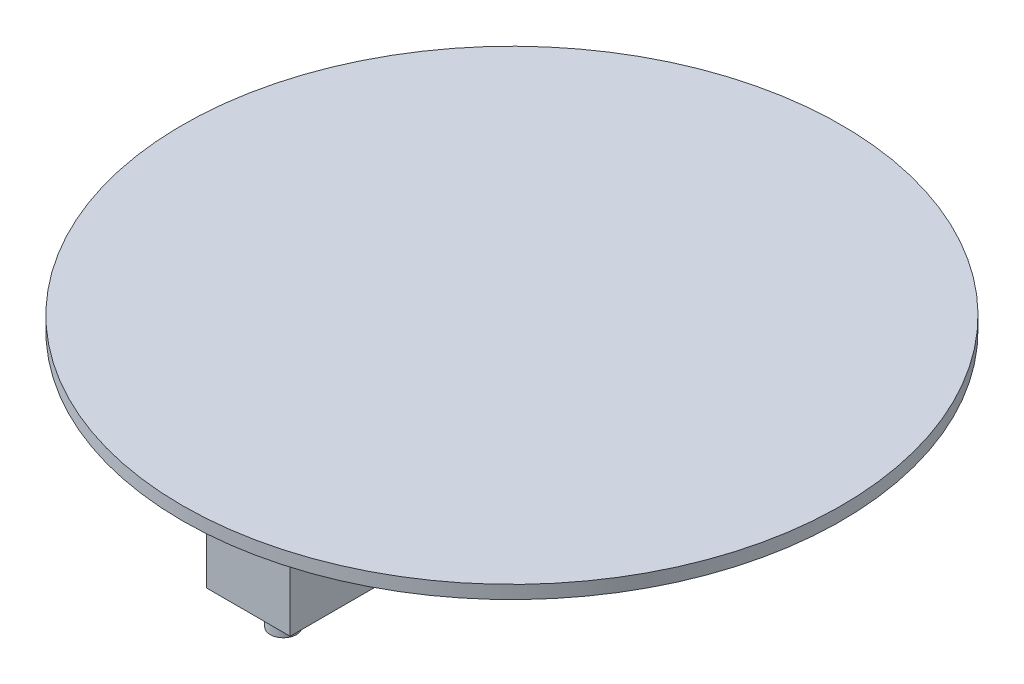
ISO-10303-21;
HEADER;
FILE_DESCRIPTION(('STEP AP214'),'2;1');
FILE_NAME('part.step','',(''),(''),'','','');
FILE_SCHEMA(('AUTOMOTIVE_DESIGN { 1 0 10303 214 1 1 1 1 }'));
ENDSEC;
DATA;
#1=APPLICATION_CONTEXT('core data for automotive mechanical design processes');
#2=APPLICATION_PROTOCOL_DEFINITION('international standard','automotive_design',2000,#1);
#3=PRODUCT_CONTEXT('',#1,'mechanical');
#4=PRODUCT('Part','Part','',(#3));
#5=PRODUCT_RELATED_PRODUCT_CATEGORY('part','',(#4));
#6=PRODUCT_DEFINITION_FORMATION('','',#4);
#7=PRODUCT_DEFINITION_CONTEXT('part definition',#1,'design');
#8=PRODUCT_DEFINITION('design','',#6,#7);
#9=PRODUCT_DEFINITION_SHAPE('','',#8);
#10=(LENGTH_UNIT() NAMED_UNIT(*) SI_UNIT(.MILLI.,.METRE.));
#11=(NAMED_UNIT(*) PLANE_ANGLE_UNIT() SI_UNIT($,.RADIAN.));
#12=(NAMED_UNIT(*) SI_UNIT($,.STERADIAN.) SOLID_ANGLE_UNIT());
#13=UNCERTAINTY_MEASURE_WITH_UNIT(LENGTH_MEASURE(1.E-05),#10,'distance_accuracy_value','');
#14=(GEOMETRIC_REPRESENTATION_CONTEXT(3) GLOBAL_UNCERTAINTY_ASSIGNED_CONTEXT((#13)) GLOBAL_UNIT_ASSIGNED_CONTEXT((#10,
#11,#12)) REPRESENTATION_CONTEXT('',''));
#15=CARTESIAN_POINT('',(0.,0.,0.));
#16=DIRECTION('',(0.,0.,1.));
#17=DIRECTION('',(1.,0.,0.));
#18=AXIS2_PLACEMENT_3D('',#15,#16,#17);
#19=CARTESIAN_POINT('',(0.,0.,80.));
#20=DIRECTION('',(1.,0.,0.));
#21=DIRECTION('',(0.,0.,-1.));
#22=AXIS2_PLACEMENT_3D('',#19,#20,#21);
#23=PLANE('',#22);
#24=CARTESIAN_POINT('',(0.,6.35,43.8));
#25=DIRECTION('',(-1.,0.,0.));
#26=DIRECTION('',(0.,0.,1.));
#27=AXIS2_PLACEMENT_3D('',#24,#25,#26);
#28=CIRCLE('',#27,5.25);
#29=CARTESIAN_POINT('',(0.,2.72750086266401,40.));
#30=VERTEX_POINT('',#29);
#31=CARTESIAN_POINT('',(0.,9.97249913733599,40.));
#32=VERTEX_POINT('',#31);
#33=EDGE_CURVE('E96',#30,#32,#28,.T.);
#34=ORIENTED_EDGE('',*,*,#33,.F.);
#35=CARTESIAN_POINT('',(0.,6.35,36.2));
#36=DIRECTION('',(-1.,0.,0.));
#37=DIRECTION('',(0.,0.,1.));
#38=AXIS2_PLACEMENT_3D('',#35,#36,#37);
#39=CIRCLE('',#38,5.25);
#40=EDGE_CURVE('E47',#32,#30,#39,.T.);
#41=ORIENTED_EDGE('',*,*,#40,.F.);
#42=EDGE_LOOP('',(#34,#41));
#43=FACE_BOUND('',#42,.T.);
#44=DIRECTION('',(0.,-1.,0.));
#45=VECTOR('',#44,1.);
#46=CARTESIAN_POINT('',(0.,0.,0.));
#47=LINE('',#46,#45);
#48=CARTESIAN_POINT('',(0.,12.7,0.));
#49=VERTEX_POINT('',#48);
#50=CARTESIAN_POINT('',(0.,0.,0.));
#51=VERTEX_POINT('',#50);
#52=EDGE_CURVE('E109',#49,#51,#47,.T.);
#53=ORIENTED_EDGE('',*,*,#52,.T.);
#54=DIRECTION('',(0.,0.,-1.));
#55=VECTOR('',#54,1.);
#56=CARTESIAN_POINT('',(0.,0.,80.));
#57=LINE('',#56,#55);
#58=CARTESIAN_POINT('',(0.,0.,80.));
#59=VERTEX_POINT('',#58);
#60=EDGE_CURVE('E11',#59,#51,#57,.T.);
#61=ORIENTED_EDGE('',*,*,#60,.F.);
#62=DIRECTION('',(0.,-1.,0.));
#63=VECTOR('',#62,1.);
#64=CARTESIAN_POINT('',(0.,0.,80.));
#65=LINE('',#64,#63);
#66=CARTESIAN_POINT('',(0.,12.7,80.));
#67=VERTEX_POINT('',#66);
#68=EDGE_CURVE('E112',#67,#59,#65,.T.);
#69=ORIENTED_EDGE('',*,*,#68,.F.);
#70=DIRECTION('',(0.,0.,-1.));
#71=VECTOR('',#70,1.);
#72=CARTESIAN_POINT('',(0.,12.7,80.));
#73=LINE('',#72,#71);
#74=EDGE_CURVE('E122',#67,#49,#73,.T.);
#75=ORIENTED_EDGE('',*,*,#74,.T.);
#76=EDGE_LOOP('',(#53,#61,#69,#75));
#77=FACE_BOUND('',#76,.T.);
#78=ADVANCED_FACE('F33',(#43,#77),#23,.F.);
#79=CARTESIAN_POINT('',(0.,0.,80.));
#80=DIRECTION('',(0.,1.,0.));
#81=DIRECTION('',(0.,0.,1.));
#82=AXIS2_PLACEMENT_3D('',#79,#80,#81);
#83=PLANE('',#82);
#84=CARTESIAN_POINT('',(6.6687205362473,0.,60.));
#85=DIRECTION('',(0.,1.,0.));
#86=DIRECTION('',(0.,0.,1.));
#87=AXIS2_PLACEMENT_3D('',#84,#85,#86);
#88=CIRCLE('',#87,2.);
#89=CARTESIAN_POINT('',(6.6687205362473,0.,62.));
#90=VERTEX_POINT('',#89);
#91=EDGE_CURVE('E220',#90,#90,#88,.T.);
#92=ORIENTED_EDGE('',*,*,#91,.T.);
#93=EDGE_LOOP('',(#92));
#94=FACE_BOUND('',#93,.T.);
#95=CARTESIAN_POINT('',(6.6687205362473,0.,75.));
#96=DIRECTION('',(0.,1.,0.));
#97=DIRECTION('',(0.,0.,1.));
#98=AXIS2_PLACEMENT_3D('',#95,#96,#97);
#99=CIRCLE('',#98,2.);
#100=CARTESIAN_POINT('',(6.6687205362473,0.,77.));
#101=VERTEX_POINT('',#100);
#102=EDGE_CURVE('E229',#101,#101,#99,.T.);
#103=ORIENTED_EDGE('',*,*,#102,.T.);
#104=EDGE_LOOP('',(#103));
#105=FACE_BOUND('',#104,.T.);
#106=DIRECTION('',(1.,0.,0.));
#107=VECTOR('',#106,1.);
#108=CARTESIAN_POINT('',(0.,0.,0.));
#109=LINE('',#108,#107);
#110=CARTESIAN_POINT('',(12.7,0.,0.));
#111=VERTEX_POINT('',#110);
#112=EDGE_CURVE('E125',#51,#111,#109,.T.);
#113=ORIENTED_EDGE('',*,*,#112,.T.);
#114=DIRECTION('',(0.,0.,-1.));
#115=VECTOR('',#114,1.);
#116=CARTESIAN_POINT('',(12.7,0.,80.));
#117=LINE('',#116,#115);
#118=CARTESIAN_POINT('',(12.7,0.,80.));
#119=VERTEX_POINT('',#118);
#120=EDGE_CURVE('E40',#119,#111,#117,.T.);
#121=ORIENTED_EDGE('',*,*,#120,.F.);
#122=DIRECTION('',(1.,0.,0.));
#123=VECTOR('',#122,1.);
#124=CARTESIAN_POINT('',(0.,0.,80.));
#125=LINE('',#124,#123);
#126=EDGE_CURVE('E115',#59,#119,#125,.T.);
#127=ORIENTED_EDGE('',*,*,#126,.F.);
#128=ORIENTED_EDGE('',*,*,#60,.T.);
#129=EDGE_LOOP('',(#113,#121,#127,#128));
#130=FACE_BOUND('',#129,.T.);
#131=ADVANCED_FACE('F153',(#94,#105,#130),#83,.F.);
#132=CARTESIAN_POINT('',(12.7,0.,80.));
#133=DIRECTION('',(-1.,0.,0.));
#134=DIRECTION('',(0.,0.,1.));
#135=AXIS2_PLACEMENT_3D('',#132,#133,#134);
#136=PLANE('',#135);
#137=CARTESIAN_POINT('',(12.7,6.35,43.8));
#138=DIRECTION('',(-1.,0.,0.));
#139=DIRECTION('',(0.,0.,1.));
#140=AXIS2_PLACEMENT_3D('',#137,#138,#139);
#141=CIRCLE('',#140,5.25);
#142=CARTESIAN_POINT('',(12.7,2.72750086266401,40.));
#143=VERTEX_POINT('',#142);
#144=CARTESIAN_POINT('',(12.7,9.97249913733599,40.));
#145=VERTEX_POINT('',#144);
#146=EDGE_CURVE('E88',#143,#145,#141,.T.);
#147=ORIENTED_EDGE('',*,*,#146,.T.);
#148=CARTESIAN_POINT('',(12.7,6.35,36.2));
#149=DIRECTION('',(-1.,0.,0.));
#150=DIRECTION('',(0.,0.,1.));
#151=AXIS2_PLACEMENT_3D('',#148,#149,#150);
#152=CIRCLE('',#151,5.25);
#153=EDGE_CURVE('E52',#145,#143,#152,.T.);
#154=ORIENTED_EDGE('',*,*,#153,.T.);
#155=EDGE_LOOP('',(#147,#154));
#156=FACE_BOUND('',#155,.T.);
#157=DIRECTION('',(0.,1.,0.));
#158=VECTOR('',#157,1.);
#159=CARTESIAN_POINT('',(12.7,0.,0.));
#160=LINE('',#159,#158);
#161=CARTESIAN_POINT('',(12.7,12.7,0.));
#162=VERTEX_POINT('',#161);
#163=EDGE_CURVE('E127',#111,#162,#160,.T.);
#164=ORIENTED_EDGE('',*,*,#163,.T.);
#165=DIRECTION('',(0.,0.,-1.));
#166=VECTOR('',#165,1.);
#167=CARTESIAN_POINT('',(12.7,12.7,80.));
#168=LINE('',#167,#166);
#169=CARTESIAN_POINT('',(12.7,12.7,80.));
#170=VERTEX_POINT('',#169);
#171=EDGE_CURVE('E132',#170,#162,#168,.T.);
#172=ORIENTED_EDGE('',*,*,#171,.F.);
#173=DIRECTION('',(0.,1.,0.));
#174=VECTOR('',#173,1.);
#175=CARTESIAN_POINT('',(12.7,0.,80.));
#176=LINE('',#175,#174);
#177=EDGE_CURVE('E118',#119,#170,#176,.T.);
#178=ORIENTED_EDGE('',*,*,#177,.F.);
#179=ORIENTED_EDGE('',*,*,#120,.T.);
#180=EDGE_LOOP('',(#164,#172,#178,#179));
#181=FACE_BOUND('',#180,.T.);
#182=ADVANCED_FACE('F94',(#156,#181),#136,.F.);
#183=CARTESIAN_POINT('',(0.,12.7,80.));
#184=DIRECTION('',(0.,-1.,0.));
#185=DIRECTION('',(0.,0.,-1.));
#186=AXIS2_PLACEMENT_3D('',#183,#184,#185);
#187=PLANE('',#186);
#188=CARTESIAN_POINT('',(6.6687205362473,12.7,5.));
#189=DIRECTION('',(0.,1.,0.));
#190=DIRECTION('',(0.,0.,1.));
#191=AXIS2_PLACEMENT_3D('',#188,#189,#190);
#192=CIRCLE('',#191,2.);
#193=CARTESIAN_POINT('',(6.6687205362473,12.7,7.));
#194=VERTEX_POINT('',#193);
#195=EDGE_CURVE('E106',#194,#194,#192,.T.);
#196=ORIENTED_EDGE('',*,*,#195,.F.);
#197=EDGE_LOOP('',(#196));
#198=FACE_BOUND('',#197,.T.);
#199=CARTESIAN_POINT('',(6.6687205362473,12.7,20.));
#200=DIRECTION('',(0.,1.,0.));
#201=DIRECTION('',(0.,0.,1.));
#202=AXIS2_PLACEMENT_3D('',#199,#200,#201);
#203=CIRCLE('',#202,2.);
#204=CARTESIAN_POINT('',(6.6687205362473,12.7,22.));
#205=VERTEX_POINT('',#204);
#206=EDGE_CURVE('E104',#205,#205,#203,.T.);
#207=ORIENTED_EDGE('',*,*,#206,.F.);
#208=EDGE_LOOP('',(#207));
#209=FACE_BOUND('',#208,.T.);
#210=DIRECTION('',(-1.,0.,0.));
#211=VECTOR('',#210,1.);
#212=CARTESIAN_POINT('',(0.,12.7,0.));
#213=LINE('',#212,#211);
#214=EDGE_CURVE('E116',#162,#49,#213,.T.);
#215=ORIENTED_EDGE('',*,*,#214,.T.);
#216=ORIENTED_EDGE('',*,*,#74,.F.);
#217=DIRECTION('',(-1.,0.,0.));
#218=VECTOR('',#217,1.);
#219=CARTESIAN_POINT('',(0.,12.7,80.));
#220=LINE('',#219,#218);
#221=EDGE_CURVE('E120',#170,#67,#220,.T.);
#222=ORIENTED_EDGE('',*,*,#221,.F.);
#223=ORIENTED_EDGE('',*,*,#171,.T.);
#224=EDGE_LOOP('',(#215,#216,#222,#223));
#225=FACE_BOUND('',#224,.T.);
#226=ADVANCED_FACE('F146',(#198,#209,#225),#187,.F.);
#227=CARTESIAN_POINT('',(0.,0.,80.));
#228=DIRECTION('',(0.,0.,-1.));
#229=DIRECTION('',(-1.,0.,0.));
#230=AXIS2_PLACEMENT_3D('',#227,#228,#229);
#231=PLANE('',#230);
#232=ORIENTED_EDGE('',*,*,#68,.T.);
#233=ORIENTED_EDGE('',*,*,#126,.T.);
#234=ORIENTED_EDGE('',*,*,#177,.T.);
#235=ORIENTED_EDGE('',*,*,#221,.T.);
#236=EDGE_LOOP('',(#232,#233,#234,#235));
#237=FACE_BOUND('',#236,.T.);
#238=ADVANCED_FACE('F152',(#237),#231,.F.);
#239=CARTESIAN_POINT('',(0.,0.,0.));
#240=DIRECTION('',(0.,0.,-1.));
#241=DIRECTION('',(-1.,0.,0.));
#242=AXIS2_PLACEMENT_3D('',#239,#240,#241);
#243=PLANE('',#242);
#244=ORIENTED_EDGE('',*,*,#52,.F.);
#245=ORIENTED_EDGE('',*,*,#214,.F.);
#246=ORIENTED_EDGE('',*,*,#163,.F.);
#247=ORIENTED_EDGE('',*,*,#112,.F.);
#248=EDGE_LOOP('',(#244,#245,#246,#247));
#249=FACE_BOUND('',#248,.T.);
#250=ADVANCED_FACE('F143',(#249),#243,.T.);
#251=CARTESIAN_POINT('',(12.7,6.35,36.2));
#252=DIRECTION('',(-1.,0.,0.));
#253=DIRECTION('',(0.,0.,1.));
#254=AXIS2_PLACEMENT_3D('',#251,#252,#253);
#255=CYLINDRICAL_SURFACE('',#254,5.25);
#256=ORIENTED_EDGE('',*,*,#40,.T.);
#257=DIRECTION('',(-1.,0.,0.));
#258=VECTOR('',#257,1.);
#259=CARTESIAN_POINT('',(12.7,2.72750086266401,40.));
#260=LINE('',#259,#258);
#261=EDGE_CURVE('E81',#143,#30,#260,.T.);
#262=ORIENTED_EDGE('',*,*,#261,.F.);
#263=ORIENTED_EDGE('',*,*,#153,.F.);
#264=DIRECTION('',(-1.,0.,0.));
#265=VECTOR('',#264,1.);
#266=CARTESIAN_POINT('',(12.7,9.97249913733599,40.));
#267=LINE('',#266,#265);
#268=EDGE_CURVE('E87',#145,#32,#267,.T.);
#269=ORIENTED_EDGE('',*,*,#268,.T.);
#270=EDGE_LOOP('',(#256,#262,#263,#269));
#271=FACE_BOUND('',#270,.T.);
#272=ADVANCED_FACE('F83',(#271),#255,.F.);
#273=CARTESIAN_POINT('',(12.7,6.35,43.8));
#274=DIRECTION('',(-1.,0.,0.));
#275=DIRECTION('',(0.,0.,1.));
#276=AXIS2_PLACEMENT_3D('',#273,#274,#275);
#277=CYLINDRICAL_SURFACE('',#276,5.25);
#278=ORIENTED_EDGE('',*,*,#33,.T.);
#279=ORIENTED_EDGE('',*,*,#268,.F.);
#280=ORIENTED_EDGE('',*,*,#146,.F.);
#281=ORIENTED_EDGE('',*,*,#261,.T.);
#282=EDGE_LOOP('',(#278,#279,#280,#281));
#283=FACE_BOUND('',#282,.T.);
#284=ADVANCED_FACE('F91',(#283),#277,.F.);
#285=CARTESIAN_POINT('',(6.6687205362473,17.,20.));
#286=DIRECTION('',(0.,-1.,0.));
#287=DIRECTION('',(0.,0.,-1.));
#288=AXIS2_PLACEMENT_3D('',#285,#286,#287);
#289=CYLINDRICAL_SURFACE('',#288,2.);
#290=CARTESIAN_POINT('',(6.6687205362473,17.,20.));
#291=DIRECTION('',(0.,1.,0.));
#292=DIRECTION('',(0.,0.,1.));
#293=AXIS2_PLACEMENT_3D('',#290,#291,#292);
#294=CIRCLE('',#293,2.);
#295=CARTESIAN_POINT('',(6.6687205362473,17.,22.));
#296=VERTEX_POINT('',#295);
#297=EDGE_CURVE('E100',#296,#296,#294,.T.);
#298=ORIENTED_EDGE('',*,*,#297,.F.);
#299=EDGE_LOOP('',(#298));
#300=FACE_BOUND('',#299,.T.);
#301=ORIENTED_EDGE('',*,*,#206,.T.);
#302=EDGE_LOOP('',(#301));
#303=FACE_BOUND('',#302,.T.);
#304=ADVANCED_FACE('F176',(#300,#303),#289,.T.);
#305=CARTESIAN_POINT('',(6.6687205362473,17.,5.));
#306=DIRECTION('',(0.,-1.,0.));
#307=DIRECTION('',(0.,0.,-1.));
#308=AXIS2_PLACEMENT_3D('',#305,#306,#307);
#309=CYLINDRICAL_SURFACE('',#308,2.);
#310=CARTESIAN_POINT('',(6.6687205362473,17.,5.));
#311=DIRECTION('',(0.,1.,0.));
#312=DIRECTION('',(0.,0.,1.));
#313=AXIS2_PLACEMENT_3D('',#310,#311,#312);
#314=CIRCLE('',#313,2.);
#315=CARTESIAN_POINT('',(6.6687205362473,17.,7.));
#316=VERTEX_POINT('',#315);
#317=EDGE_CURVE('E231',#316,#316,#314,.T.);
#318=ORIENTED_EDGE('',*,*,#317,.F.);
#319=EDGE_LOOP('',(#318));
#320=FACE_BOUND('',#319,.T.);
#321=ORIENTED_EDGE('',*,*,#195,.T.);
#322=EDGE_LOOP('',(#321));
#323=FACE_BOUND('',#322,.T.);
#324=ADVANCED_FACE('F179',(#320,#323),#309,.T.);
#325=CARTESIAN_POINT('',(6.6687205362473,-4.3,75.));
#326=DIRECTION('',(0.,1.,0.));
#327=DIRECTION('',(0.,0.,1.));
#328=AXIS2_PLACEMENT_3D('',#325,#326,#327);
#329=CYLINDRICAL_SURFACE('',#328,2.);
#330=CARTESIAN_POINT('',(6.6687205362473,-4.3,75.));
#331=DIRECTION('',(0.,1.,0.));
#332=DIRECTION('',(0.,0.,1.));
#333=AXIS2_PLACEMENT_3D('',#330,#331,#332);
#334=CIRCLE('',#333,2.);
#335=CARTESIAN_POINT('',(6.6687205362473,-4.3,77.));
#336=VERTEX_POINT('',#335);
#337=EDGE_CURVE('E226',#336,#336,#334,.T.);
#338=ORIENTED_EDGE('',*,*,#337,.T.);
#339=EDGE_LOOP('',(#338));
#340=FACE_BOUND('',#339,.T.);
#341=ORIENTED_EDGE('',*,*,#102,.F.);
#342=EDGE_LOOP('',(#341));
#343=FACE_BOUND('',#342,.T.);
#344=ADVANCED_FACE('F183',(#340,#343),#329,.T.);
#345=CARTESIAN_POINT('',(6.6687205362473,-4.3,75.));
#346=DIRECTION('',(0.,1.,0.));
#347=DIRECTION('',(0.,0.,1.));
#348=AXIS2_PLACEMENT_3D('',#345,#346,#347);
#349=PLANE('',#348);
#350=ORIENTED_EDGE('',*,*,#337,.F.);
#351=EDGE_LOOP('',(#350));
#352=FACE_BOUND('',#351,.T.);
#353=ADVANCED_FACE('F187',(#352),#349,.F.);
#354=CARTESIAN_POINT('',(6.6687205362473,-4.3,60.));
#355=DIRECTION('',(0.,1.,0.));
#356=DIRECTION('',(0.,0.,1.));
#357=AXIS2_PLACEMENT_3D('',#354,#355,#356);
#358=CYLINDRICAL_SURFACE('',#357,2.);
#359=CARTESIAN_POINT('',(6.6687205362473,-4.3,60.));
#360=DIRECTION('',(0.,1.,0.));
#361=DIRECTION('',(0.,0.,1.));
#362=AXIS2_PLACEMENT_3D('',#359,#360,#361);
#363=CIRCLE('',#362,2.);
#364=CARTESIAN_POINT('',(6.6687205362473,-4.3,62.));
#365=VERTEX_POINT('',#364);
#366=EDGE_CURVE('E216',#365,#365,#363,.T.);
#367=ORIENTED_EDGE('',*,*,#366,.T.);
#368=EDGE_LOOP('',(#367));
#369=FACE_BOUND('',#368,.T.);
#370=ORIENTED_EDGE('',*,*,#91,.F.);
#371=EDGE_LOOP('',(#370));
#372=FACE_BOUND('',#371,.T.);
#373=ADVANCED_FACE('F191',(#369,#372),#358,.T.);
#374=CARTESIAN_POINT('',(6.6687205362473,-4.3,60.));
#375=DIRECTION('',(0.,1.,0.));
#376=DIRECTION('',(0.,0.,1.));
#377=AXIS2_PLACEMENT_3D('',#374,#375,#376);
#378=PLANE('',#377);
#379=ORIENTED_EDGE('',*,*,#366,.F.);
#380=EDGE_LOOP('',(#379));
#381=FACE_BOUND('',#380,.T.);
#382=ADVANCED_FACE('F195',(#381),#378,.F.);
#383=CARTESIAN_POINT('',(6.35,19.,40.));
#384=DIRECTION('',(0.,-1.,0.));
#385=DIRECTION('',(0.,0.,-1.));
#386=AXIS2_PLACEMENT_3D('',#383,#384,#385);
#387=CYLINDRICAL_SURFACE('',#386,50.);
#388=CARTESIAN_POINT('',(6.35,19.,40.));
#389=DIRECTION('',(0.,1.,0.));
#390=DIRECTION('',(0.,0.,1.));
#391=AXIS2_PLACEMENT_3D('',#388,#389,#390);
#392=CIRCLE('',#391,50.);
#393=CARTESIAN_POINT('',(6.35,19.,90.));
#394=VERTEX_POINT('',#393);
#395=EDGE_CURVE('E215',#394,#394,#392,.T.);
#396=ORIENTED_EDGE('',*,*,#395,.F.);
#397=EDGE_LOOP('',(#396));
#398=FACE_BOUND('',#397,.T.);
#399=CARTESIAN_POINT('',(6.35,17.,40.));
#400=DIRECTION('',(0.,1.,0.));
#401=DIRECTION('',(0.,0.,1.));
#402=AXIS2_PLACEMENT_3D('',#399,#400,#401);
#403=CIRCLE('',#402,50.);
#404=CARTESIAN_POINT('',(6.35,17.,90.));
#405=VERTEX_POINT('',#404);
#406=EDGE_CURVE('E217',#405,#405,#403,.T.);
#407=ORIENTED_EDGE('',*,*,#406,.T.);
#408=EDGE_LOOP('',(#407));
#409=FACE_BOUND('',#408,.T.);
#410=ADVANCED_FACE('F199',(#398,#409),#387,.T.);
#411=CARTESIAN_POINT('',(6.35,19.,40.));
#412=DIRECTION('',(0.,1.,0.));
#413=DIRECTION('',(0.,0.,1.));
#414=AXIS2_PLACEMENT_3D('',#411,#412,#413);
#415=PLANE('',#414);
#416=ORIENTED_EDGE('',*,*,#395,.T.);
#417=EDGE_LOOP('',(#416));
#418=FACE_BOUND('',#417,.T.);
#419=ADVANCED_FACE('F203',(#418),#415,.T.);
#420=CARTESIAN_POINT('',(6.35,17.,40.));
#421=DIRECTION('',(0.,1.,0.));
#422=DIRECTION('',(0.,0.,1.));
#423=AXIS2_PLACEMENT_3D('',#420,#421,#422);
#424=PLANE('',#423);
#425=ORIENTED_EDGE('',*,*,#297,.T.);
#426=EDGE_LOOP('',(#425));
#427=FACE_BOUND('',#426,.T.);
#428=ORIENTED_EDGE('',*,*,#317,.T.);
#429=EDGE_LOOP('',(#428));
#430=FACE_BOUND('',#429,.T.);
#431=ORIENTED_EDGE('',*,*,#406,.F.);
#432=EDGE_LOOP('',(#431));
#433=FACE_BOUND('',#432,.T.);
#434=ADVANCED_FACE('F205',(#427,#430,#433),#424,.F.);
#435=CLOSED_SHELL('',(#78,#131,#182,#226,#238,#250,#272,#284,#304,#324,#344,#353,#373,#382,#410,
#419,#434));
#436=MANIFOLD_SOLID_BREP('B2',#435);
#437=ADVANCED_BREP_SHAPE_REPRESENTATION('',(#18,#436),#14);
#438=SHAPE_DEFINITION_REPRESENTATION(#9,#437);
ENDSEC;
END-ISO-10303-21;
